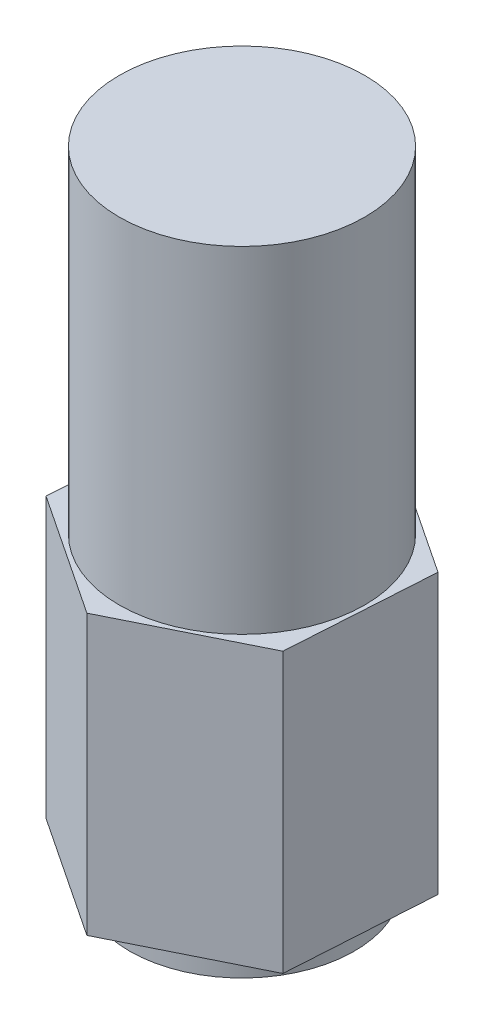
ISO-10303-21;
HEADER;
FILE_DESCRIPTION(('STEP AP214'),'2;1');
FILE_NAME('part.step','',(''),(''),'','','');
FILE_SCHEMA(('AUTOMOTIVE_DESIGN { 1 0 10303 214 1 1 1 1 }'));
ENDSEC;
DATA;
#1=APPLICATION_CONTEXT('core data for automotive mechanical design processes');
#2=APPLICATION_PROTOCOL_DEFINITION('international standard','automotive_design',2000,#1);
#3=PRODUCT_CONTEXT('',#1,'mechanical');
#4=PRODUCT('Part','Part','',(#3));
#5=PRODUCT_RELATED_PRODUCT_CATEGORY('part','',(#4));
#6=PRODUCT_DEFINITION_FORMATION('','',#4);
#7=PRODUCT_DEFINITION_CONTEXT('part definition',#1,'design');
#8=PRODUCT_DEFINITION('design','',#6,#7);
#9=PRODUCT_DEFINITION_SHAPE('','',#8);
#10=(LENGTH_UNIT() NAMED_UNIT(*) SI_UNIT(.MILLI.,.METRE.));
#11=(NAMED_UNIT(*) PLANE_ANGLE_UNIT() SI_UNIT($,.RADIAN.));
#12=(NAMED_UNIT(*) SI_UNIT($,.STERADIAN.) SOLID_ANGLE_UNIT());
#13=UNCERTAINTY_MEASURE_WITH_UNIT(LENGTH_MEASURE(1.E-05),#10,'distance_accuracy_value','');
#14=(GEOMETRIC_REPRESENTATION_CONTEXT(3) GLOBAL_UNCERTAINTY_ASSIGNED_CONTEXT((#13)) GLOBAL_UNIT_ASSIGNED_CONTEXT((#10,
#11,#12)) REPRESENTATION_CONTEXT('',''));
#15=CARTESIAN_POINT('',(0.,0.,0.));
#16=DIRECTION('',(0.,0.,1.));
#17=DIRECTION('',(1.,0.,0.));
#18=AXIS2_PLACEMENT_3D('',#15,#16,#17);
#19=CARTESIAN_POINT('',(0.,1.,0.));
#20=DIRECTION('',(0.,-1.,0.));
#21=DIRECTION('',(0.,0.,-1.));
#22=AXIS2_PLACEMENT_3D('',#19,#20,#21);
#23=CYLINDRICAL_SURFACE('',#22,4.35);
#24=CARTESIAN_POINT('',(0.,1.,0.));
#25=DIRECTION('',(0.,1.,0.));
#26=DIRECTION('',(0.,0.,1.));
#27=AXIS2_PLACEMENT_3D('',#24,#25,#26);
#28=CIRCLE('',#27,4.35);
#29=CARTESIAN_POINT('',(0.,1.,4.35));
#30=VERTEX_POINT('',#29);
#31=EDGE_CURVE('E55',#30,#30,#28,.T.);
#32=ORIENTED_EDGE('',*,*,#31,.F.);
#33=EDGE_LOOP('',(#32));
#34=FACE_BOUND('',#33,.T.);
#35=CARTESIAN_POINT('',(0.,0.,0.));
#36=DIRECTION('',(0.,1.,0.));
#37=DIRECTION('',(0.,0.,1.));
#38=AXIS2_PLACEMENT_3D('',#35,#36,#37);
#39=CIRCLE('',#38,4.35);
#40=CARTESIAN_POINT('',(0.,0.,4.35));
#41=VERTEX_POINT('',#40);
#42=EDGE_CURVE('E48',#41,#41,#39,.T.);
#43=ORIENTED_EDGE('',*,*,#42,.T.);
#44=EDGE_LOOP('',(#43));
#45=FACE_BOUND('',#44,.T.);
#46=ADVANCED_FACE('F45',(#34,#45),#23,.T.);
#47=CARTESIAN_POINT('',(0.,0.,0.));
#48=DIRECTION('',(0.,1.,0.));
#49=DIRECTION('',(0.,0.,1.));
#50=AXIS2_PLACEMENT_3D('',#47,#48,#49);
#51=PLANE('',#50);
#52=ORIENTED_EDGE('',*,*,#42,.F.);
#53=EDGE_LOOP('',(#52));
#54=FACE_BOUND('',#53,.T.);
#55=ADVANCED_FACE('F176',(#54),#51,.F.);
#56=CARTESIAN_POINT('',(-0.354834311847509,11.8,5.64689524822881));
#57=DIRECTION('',(-0.44470441527597,0.,-0.895677387809951));
#58=DIRECTION('',(-0.895677387809951,0.,0.444704415275971));
#59=AXIS2_PLACEMENT_3D('',#56,#57,#58);
#60=PLANE('',#59);
#61=DIRECTION('',(0.895677387809951,0.,-0.44470441527597));
#62=VECTOR('',#61,1.);
#63=CARTESIAN_POINT('',(-0.354834311847509,1.,5.64689524822881));
#64=LINE('',#63,#62);
#65=CARTESIAN_POINT('',(-0.354834311847509,1.,5.64689524822881));
#66=VERTEX_POINT('',#65);
#67=CARTESIAN_POINT('',(4.71293758155203,1.,3.13074315230872));
#68=VERTEX_POINT('',#67);
#69=EDGE_CURVE('E137',#66,#68,#64,.T.);
#70=ORIENTED_EDGE('',*,*,#69,.T.);
#71=DIRECTION('',(0.,-1.,0.));
#72=VECTOR('',#71,1.);
#73=CARTESIAN_POINT('',(4.71293758155203,11.8,3.13074315230872));
#74=LINE('',#73,#72);
#75=CARTESIAN_POINT('',(4.71293758155203,11.8,3.13074315230872));
#76=VERTEX_POINT('',#75);
#77=EDGE_CURVE('E165',#76,#68,#74,.T.);
#78=ORIENTED_EDGE('',*,*,#77,.F.);
#79=DIRECTION('',(0.895677387809951,0.,-0.44470441527597));
#80=VECTOR('',#79,1.);
#81=CARTESIAN_POINT('',(-0.354834311847509,11.8,5.64689524822881));
#82=LINE('',#81,#80);
#83=CARTESIAN_POINT('',(-0.354834311847509,11.8,5.64689524822881));
#84=VERTEX_POINT('',#83);
#85=EDGE_CURVE('E154',#84,#76,#82,.T.);
#86=ORIENTED_EDGE('',*,*,#85,.F.);
#87=DIRECTION('',(0.,-1.,0.));
#88=VECTOR('',#87,1.);
#89=CARTESIAN_POINT('',(-0.354834311847509,11.8,5.64689524822881));
#90=LINE('',#89,#88);
#91=EDGE_CURVE('E133',#84,#66,#90,.T.);
#92=ORIENTED_EDGE('',*,*,#91,.T.);
#93=EDGE_LOOP('',(#70,#78,#86,#92));
#94=FACE_BOUND('',#93,.T.);
#95=ADVANCED_FACE('F178',(#94),#60,.F.);
#96=CARTESIAN_POINT('',(4.71293758155203,11.8,3.13074315230872));
#97=DIRECTION('',(-0.998031579076689,0.,-0.06271337310088));
#98=DIRECTION('',(-0.06271337310088,0.,0.998031579076689));
#99=AXIS2_PLACEMENT_3D('',#96,#97,#98);
#100=PLANE('',#99);
#101=DIRECTION('',(0.06271337310088,0.,-0.998031579076689));
#102=VECTOR('',#101,1.);
#103=CARTESIAN_POINT('',(4.71293758155203,1.,3.13074315230872));
#104=LINE('',#103,#102);
#105=CARTESIAN_POINT('',(5.06777189339953,1.,-2.51615209592009));
#106=VERTEX_POINT('',#105);
#107=EDGE_CURVE('E141',#68,#106,#104,.T.);
#108=ORIENTED_EDGE('',*,*,#107,.T.);
#109=DIRECTION('',(0.,-1.,0.));
#110=VECTOR('',#109,1.);
#111=CARTESIAN_POINT('',(5.06777189339953,11.8,-2.51615209592009));
#112=LINE('',#111,#110);
#113=CARTESIAN_POINT('',(5.06777189339953,11.8,-2.51615209592009));
#114=VERTEX_POINT('',#113);
#115=EDGE_CURVE('E161',#114,#106,#112,.T.);
#116=ORIENTED_EDGE('',*,*,#115,.F.);
#117=DIRECTION('',(0.06271337310088,0.,-0.998031579076689));
#118=VECTOR('',#117,1.);
#119=CARTESIAN_POINT('',(4.71293758155203,11.8,3.13074315230872));
#120=LINE('',#119,#118);
#121=EDGE_CURVE('E102',#76,#114,#120,.T.);
#122=ORIENTED_EDGE('',*,*,#121,.F.);
#123=ORIENTED_EDGE('',*,*,#77,.T.);
#124=EDGE_LOOP('',(#108,#116,#122,#123));
#125=FACE_BOUND('',#124,.T.);
#126=ADVANCED_FACE('F183',(#125),#100,.F.);
#127=CARTESIAN_POINT('',(5.06777189339953,11.8,-2.51615209592009));
#128=DIRECTION('',(-0.553327163800719,0.,0.83296401470907));
#129=DIRECTION('',(0.832964014709071,0.,0.553327163800719));
#130=AXIS2_PLACEMENT_3D('',#127,#128,#129);
#131=PLANE('',#130);
#132=DIRECTION('',(-0.83296401470907,0.,-0.553327163800719));
#133=VECTOR('',#132,1.);
#134=CARTESIAN_POINT('',(5.06777189339953,1.,-2.51615209592009));
#135=LINE('',#134,#133);
#136=CARTESIAN_POINT('',(0.354834311847512,1.,-5.6468952482288));
#137=VERTEX_POINT('',#136);
#138=EDGE_CURVE('E145',#106,#137,#135,.T.);
#139=ORIENTED_EDGE('',*,*,#138,.T.);
#140=DIRECTION('',(0.,-1.,0.));
#141=VECTOR('',#140,1.);
#142=CARTESIAN_POINT('',(0.354834311847512,11.8,-5.6468952482288));
#143=LINE('',#142,#141);
#144=CARTESIAN_POINT('',(0.354834311847512,11.8,-5.6468952482288));
#145=VERTEX_POINT('',#144);
#146=EDGE_CURVE('E126',#145,#137,#143,.T.);
#147=ORIENTED_EDGE('',*,*,#146,.F.);
#148=DIRECTION('',(-0.83296401470907,0.,-0.553327163800719));
#149=VECTOR('',#148,1.);
#150=CARTESIAN_POINT('',(5.06777189339953,11.8,-2.51615209592009));
#151=LINE('',#150,#149);
#152=EDGE_CURVE('E115',#114,#145,#151,.T.);
#153=ORIENTED_EDGE('',*,*,#152,.F.);
#154=ORIENTED_EDGE('',*,*,#115,.T.);
#155=EDGE_LOOP('',(#139,#147,#153,#154));
#156=FACE_BOUND('',#155,.T.);
#157=ADVANCED_FACE('F190',(#156),#131,.F.);
#158=CARTESIAN_POINT('',(0.354834311847512,11.8,-5.6468952482288));
#159=DIRECTION('',(0.44470441527597,0.,0.895677387809951));
#160=DIRECTION('',(0.895677387809951,0.,-0.44470441527597));
#161=AXIS2_PLACEMENT_3D('',#158,#159,#160);
#162=PLANE('',#161);
#163=DIRECTION('',(-0.895677387809951,0.,0.44470441527597));
#164=VECTOR('',#163,1.);
#165=CARTESIAN_POINT('',(0.354834311847512,1.,-5.6468952482288));
#166=LINE('',#165,#164);
#167=CARTESIAN_POINT('',(-4.71293758155202,1.,-3.13074315230872));
#168=VERTEX_POINT('',#167);
#169=EDGE_CURVE('E124',#137,#168,#166,.T.);
#170=ORIENTED_EDGE('',*,*,#169,.T.);
#171=DIRECTION('',(0.,-1.,0.));
#172=VECTOR('',#171,1.);
#173=CARTESIAN_POINT('',(-4.71293758155202,11.8,-3.13074315230872));
#174=LINE('',#173,#172);
#175=CARTESIAN_POINT('',(-4.71293758155202,11.8,-3.13074315230872));
#176=VERTEX_POINT('',#175);
#177=EDGE_CURVE('E121',#176,#168,#174,.T.);
#178=ORIENTED_EDGE('',*,*,#177,.F.);
#179=DIRECTION('',(-0.895677387809951,0.,0.44470441527597));
#180=VECTOR('',#179,1.);
#181=CARTESIAN_POINT('',(0.354834311847512,11.8,-5.6468952482288));
#182=LINE('',#181,#180);
#183=EDGE_CURVE('E109',#145,#176,#182,.T.);
#184=ORIENTED_EDGE('',*,*,#183,.F.);
#185=ORIENTED_EDGE('',*,*,#146,.T.);
#186=EDGE_LOOP('',(#170,#178,#184,#185));
#187=FACE_BOUND('',#186,.T.);
#188=ADVANCED_FACE('F122',(#187),#162,.F.);
#189=CARTESIAN_POINT('',(-4.71293758155202,11.8,-3.13074315230872));
#190=DIRECTION('',(0.998031579076689,0.,0.0627133731008803));
#191=DIRECTION('',(0.0627133731008803,0.,-0.998031579076689));
#192=AXIS2_PLACEMENT_3D('',#189,#190,#191);
#193=PLANE('',#192);
#194=DIRECTION('',(-0.0627133731008803,0.,0.998031579076689));
#195=VECTOR('',#194,1.);
#196=CARTESIAN_POINT('',(-4.71293758155202,1.,-3.13074315230872));
#197=LINE('',#196,#195);
#198=CARTESIAN_POINT('',(-5.06777189339953,1.,2.51615209592009));
#199=VERTEX_POINT('',#198);
#200=EDGE_CURVE('E87',#168,#199,#197,.T.);
#201=ORIENTED_EDGE('',*,*,#200,.T.);
#202=DIRECTION('',(0.,-1.,0.));
#203=VECTOR('',#202,1.);
#204=CARTESIAN_POINT('',(-5.06777189339953,11.8,2.51615209592009));
#205=LINE('',#204,#203);
#206=CARTESIAN_POINT('',(-5.06777189339953,11.8,2.51615209592009));
#207=VERTEX_POINT('',#206);
#208=EDGE_CURVE('E127',#207,#199,#205,.T.);
#209=ORIENTED_EDGE('',*,*,#208,.F.);
#210=DIRECTION('',(-0.0627133731008803,0.,0.998031579076689));
#211=VECTOR('',#210,1.);
#212=CARTESIAN_POINT('',(-4.71293758155202,11.8,-3.13074315230872));
#213=LINE('',#212,#211);
#214=EDGE_CURVE('E113',#176,#207,#213,.T.);
#215=ORIENTED_EDGE('',*,*,#214,.F.);
#216=ORIENTED_EDGE('',*,*,#177,.T.);
#217=EDGE_LOOP('',(#201,#209,#215,#216));
#218=FACE_BOUND('',#217,.T.);
#219=ADVANCED_FACE('F129',(#218),#193,.F.);
#220=CARTESIAN_POINT('',(-5.06777189339953,11.8,2.51615209592009));
#221=DIRECTION('',(0.553327163800719,0.,-0.83296401470907));
#222=DIRECTION('',(-0.832964014709071,0.,-0.553327163800719));
#223=AXIS2_PLACEMENT_3D('',#220,#221,#222);
#224=PLANE('',#223);
#225=DIRECTION('',(0.83296401470907,0.,0.553327163800719));
#226=VECTOR('',#225,1.);
#227=CARTESIAN_POINT('',(-5.06777189339953,1.,2.51615209592009));
#228=LINE('',#227,#226);
#229=EDGE_CURVE('E93',#199,#66,#228,.T.);
#230=ORIENTED_EDGE('',*,*,#229,.T.);
#231=ORIENTED_EDGE('',*,*,#91,.F.);
#232=DIRECTION('',(0.83296401470907,0.,0.553327163800719));
#233=VECTOR('',#232,1.);
#234=CARTESIAN_POINT('',(-5.06777189339953,11.8,2.51615209592009));
#235=LINE('',#234,#233);
#236=EDGE_CURVE('E64',#207,#84,#235,.T.);
#237=ORIENTED_EDGE('',*,*,#236,.F.);
#238=ORIENTED_EDGE('',*,*,#208,.T.);
#239=EDGE_LOOP('',(#230,#231,#237,#238));
#240=FACE_BOUND('',#239,.T.);
#241=ADVANCED_FACE('F198',(#240),#224,.F.);
#242=CARTESIAN_POINT('',(0.,11.8,0.));
#243=DIRECTION('',(0.,1.,0.));
#244=DIRECTION('',(0.,0.,1.));
#245=AXIS2_PLACEMENT_3D('',#242,#243,#244);
#246=PLANE('',#245);
#247=CARTESIAN_POINT('',(0.,11.8,0.));
#248=DIRECTION('',(0.,1.,0.));
#249=DIRECTION('',(0.,0.,1.));
#250=AXIS2_PLACEMENT_3D('',#247,#248,#249);
#251=CIRCLE('',#250,4.75);
#252=CARTESIAN_POINT('',(0.,11.8,-4.75));
#253=VERTEX_POINT('',#252);
#254=EDGE_CURVE('E11',#253,#253,#251,.T.);
#255=ORIENTED_EDGE('',*,*,#254,.F.);
#256=EDGE_LOOP('',(#255));
#257=FACE_BOUND('',#256,.T.);
#258=ORIENTED_EDGE('',*,*,#85,.T.);
#259=ORIENTED_EDGE('',*,*,#121,.T.);
#260=ORIENTED_EDGE('',*,*,#152,.T.);
#261=ORIENTED_EDGE('',*,*,#183,.T.);
#262=ORIENTED_EDGE('',*,*,#214,.T.);
#263=ORIENTED_EDGE('',*,*,#236,.T.);
#264=EDGE_LOOP('',(#258,#259,#260,#261,#262,#263));
#265=FACE_BOUND('',#264,.T.);
#266=ADVANCED_FACE('F111',(#257,#265),#246,.T.);
#267=CARTESIAN_POINT('',(0.,1.,0.));
#268=DIRECTION('',(0.,1.,0.));
#269=DIRECTION('',(0.,0.,1.));
#270=AXIS2_PLACEMENT_3D('',#267,#268,#269);
#271=PLANE('',#270);
#272=ORIENTED_EDGE('',*,*,#31,.T.);
#273=EDGE_LOOP('',(#272));
#274=FACE_BOUND('',#273,.T.);
#275=ORIENTED_EDGE('',*,*,#69,.F.);
#276=ORIENTED_EDGE('',*,*,#229,.F.);
#277=ORIENTED_EDGE('',*,*,#200,.F.);
#278=ORIENTED_EDGE('',*,*,#169,.F.);
#279=ORIENTED_EDGE('',*,*,#138,.F.);
#280=ORIENTED_EDGE('',*,*,#107,.F.);
#281=EDGE_LOOP('',(#275,#276,#277,#278,#279,#280));
#282=FACE_BOUND('',#281,.T.);
#283=ADVANCED_FACE('F201',(#274,#282),#271,.F.);
#284=CARTESIAN_POINT('',(0.,24.8,0.));
#285=DIRECTION('',(0.,-1.,0.));
#286=DIRECTION('',(0.,0.,-1.));
#287=AXIS2_PLACEMENT_3D('',#284,#285,#286);
#288=CYLINDRICAL_SURFACE('',#287,4.75);
#289=CARTESIAN_POINT('',(0.,24.8,0.));
#290=DIRECTION('',(0.,1.,0.));
#291=DIRECTION('',(0.,0.,1.));
#292=AXIS2_PLACEMENT_3D('',#289,#290,#291);
#293=CIRCLE('',#292,4.75);
#294=CARTESIAN_POINT('',(0.,24.8,-4.75));
#295=VERTEX_POINT('',#294);
#296=EDGE_CURVE('E142',#295,#295,#293,.T.);
#297=CARTESIAN_POINT('',(0.,24.8,-4.75));
#298=CARTESIAN_POINT('',(0.,24.6645833333333,-4.75));
#299=CARTESIAN_POINT('',(0.,24.5291666666667,-4.75));
#300=CARTESIAN_POINT('',(0.,24.2583333333333,-4.75));
#301=CARTESIAN_POINT('',(0.,24.1229166666667,-4.75));
#302=CARTESIAN_POINT('',(0.,23.8520833333333,-4.75));
#303=CARTESIAN_POINT('',(0.,23.7166666666667,-4.75));
#304=CARTESIAN_POINT('',(0.,23.4458333333333,-4.75));
#305=CARTESIAN_POINT('',(0.,23.3104166666667,-4.75));
#306=CARTESIAN_POINT('',(0.,23.0395833333333,-4.75));
#307=CARTESIAN_POINT('',(0.,22.9041666666667,-4.75));
#308=CARTESIAN_POINT('',(0.,22.6333333333333,-4.75));
#309=CARTESIAN_POINT('',(0.,22.4979166666667,-4.75));
#310=CARTESIAN_POINT('',(0.,22.2270833333333,-4.75));
#311=CARTESIAN_POINT('',(0.,22.0916666666667,-4.75));
#312=CARTESIAN_POINT('',(0.,21.8208333333333,-4.75));
#313=CARTESIAN_POINT('',(0.,21.6854166666667,-4.75));
#314=CARTESIAN_POINT('',(0.,21.4145833333333,-4.75));
#315=CARTESIAN_POINT('',(0.,21.2791666666667,-4.75));
#316=CARTESIAN_POINT('',(0.,21.0083333333333,-4.75));
#317=CARTESIAN_POINT('',(0.,20.8729166666667,-4.75));
#318=CARTESIAN_POINT('',(0.,20.6020833333333,-4.75));
#319=CARTESIAN_POINT('',(0.,20.4666666666667,-4.75));
#320=CARTESIAN_POINT('',(0.,20.1958333333333,-4.75));
#321=CARTESIAN_POINT('',(0.,20.0604166666667,-4.75));
#322=CARTESIAN_POINT('',(0.,19.7895833333333,-4.75));
#323=CARTESIAN_POINT('',(0.,19.6541666666667,-4.75));
#324=CARTESIAN_POINT('',(0.,19.3833333333333,-4.75));
#325=CARTESIAN_POINT('',(0.,19.2479166666667,-4.75));
#326=CARTESIAN_POINT('',(0.,18.9770833333333,-4.75));
#327=CARTESIAN_POINT('',(0.,18.8416666666667,-4.75));
#328=CARTESIAN_POINT('',(0.,18.5708333333333,-4.75));
#329=CARTESIAN_POINT('',(0.,18.4354166666667,-4.75));
#330=CARTESIAN_POINT('',(0.,18.1645833333333,-4.75));
#331=CARTESIAN_POINT('',(0.,18.0291666666667,-4.75));
#332=CARTESIAN_POINT('',(0.,17.7583333333333,-4.75));
#333=CARTESIAN_POINT('',(0.,17.6229166666667,-4.75));
#334=CARTESIAN_POINT('',(0.,17.3520833333333,-4.75));
#335=CARTESIAN_POINT('',(0.,17.2166666666667,-4.75));
#336=CARTESIAN_POINT('',(0.,16.9458333333333,-4.75));
#337=CARTESIAN_POINT('',(0.,16.8104166666667,-4.75));
#338=CARTESIAN_POINT('',(0.,16.5395833333333,-4.75));
#339=CARTESIAN_POINT('',(0.,16.4041666666667,-4.75));
#340=CARTESIAN_POINT('',(0.,16.1333333333333,-4.75));
#341=CARTESIAN_POINT('',(0.,15.9979166666667,-4.75));
#342=CARTESIAN_POINT('',(0.,15.7270833333333,-4.75));
#343=CARTESIAN_POINT('',(0.,15.5916666666667,-4.75));
#344=CARTESIAN_POINT('',(0.,15.3208333333333,-4.75));
#345=CARTESIAN_POINT('',(0.,15.1854166666667,-4.75));
#346=CARTESIAN_POINT('',(0.,14.9145833333333,-4.75));
#347=CARTESIAN_POINT('',(0.,14.7791666666667,-4.75));
#348=CARTESIAN_POINT('',(0.,14.5083333333333,-4.75));
#349=CARTESIAN_POINT('',(0.,14.3729166666667,-4.75));
#350=CARTESIAN_POINT('',(0.,14.1020833333333,-4.75));
#351=CARTESIAN_POINT('',(0.,13.9666666666667,-4.75));
#352=CARTESIAN_POINT('',(0.,13.6958333333333,-4.75));
#353=CARTESIAN_POINT('',(0.,13.5604166666667,-4.75));
#354=CARTESIAN_POINT('',(0.,13.2895833333333,-4.75));
#355=CARTESIAN_POINT('',(0.,13.1541666666667,-4.75));
#356=CARTESIAN_POINT('',(0.,12.8833333333333,-4.75));
#357=CARTESIAN_POINT('',(0.,12.7479166666667,-4.75));
#358=CARTESIAN_POINT('',(0.,12.4770833333333,-4.75));
#359=CARTESIAN_POINT('',(0.,12.3416666666667,-4.75));
#360=CARTESIAN_POINT('',(0.,12.0708333333333,-4.75));
#361=CARTESIAN_POINT('',(0.,11.9354166666667,-4.75));
#362=CARTESIAN_POINT('',(0.,11.8,-4.75));
#363=B_SPLINE_CURVE_WITH_KNOTS('',3,(#297,#298,#299,#300,#301,#302,#303,#304,#305,#306,#307,
#308,#309,#310,#311,#312,#313,#314,#315,#316,#317,#318,#319,#320,#321,#322,#323,#324,#325,#326,
#327,#328,#329,#330,#331,#332,#333,#334,#335,#336,#337,#338,#339,#340,#341,#342,#343,#344,#345,
#346,#347,#348,#349,#350,#351,#352,#353,#354,#355,#356,#357,#358,#359,#360,#361,#362),
.UNSPECIFIED.,.F.,.F.,(4,2,2,2,2,2,2,2,2,2,2,2,2,2,2,2,2,2,2,2,2,2,2,2,2,2,2,2,2,2,2,2,4),(0.,
0.40625,0.812500000000001,1.21875,1.625,2.03125,2.4375,2.84375,3.25,3.65625,4.0625,4.46875,
4.875,5.28125,5.6875,6.09375,6.5,6.90625,7.3125,7.71875,8.125,8.53125,8.9375,9.34375,9.75,
10.15625,10.5625,10.96875,11.375,11.78125,12.1875,12.59375,13.),.UNSPECIFIED.);
#364=EDGE_CURVE('BSEAM204',#295,#253,#363,.T.);
#365=ORIENTED_EDGE('',*,*,#296,.F.);
#366=ORIENTED_EDGE('',*,*,#254,.T.);
#367=ORIENTED_EDGE('',*,*,#364,.T.);
#368=ORIENTED_EDGE('',*,*,#364,.F.);
#369=EDGE_LOOP('',(#365,#367,#366,#368));
#370=FACE_BOUND('',#369,.T.);
#371=ADVANCED_FACE('F204',(#370),#288,.T.);
#372=CARTESIAN_POINT('',(0.,24.8,0.));
#373=DIRECTION('',(0.,1.,0.));
#374=DIRECTION('',(0.,0.,1.));
#375=AXIS2_PLACEMENT_3D('',#372,#373,#374);
#376=PLANE('',#375);
#377=ORIENTED_EDGE('',*,*,#296,.T.);
#378=EDGE_LOOP('',(#377));
#379=FACE_BOUND('',#378,.T.);
#380=ADVANCED_FACE('F210',(#379),#376,.T.);
#381=CLOSED_SHELL('',(#46,#55,#95,#126,#157,#188,#219,#241,#266,#283,#371,#380));
#382=MANIFOLD_SOLID_BREP('B2',#381);
#383=ADVANCED_BREP_SHAPE_REPRESENTATION('',(#18,#382),#14);
#384=SHAPE_DEFINITION_REPRESENTATION(#9,#383);
ENDSEC;
END-ISO-10303-21;
